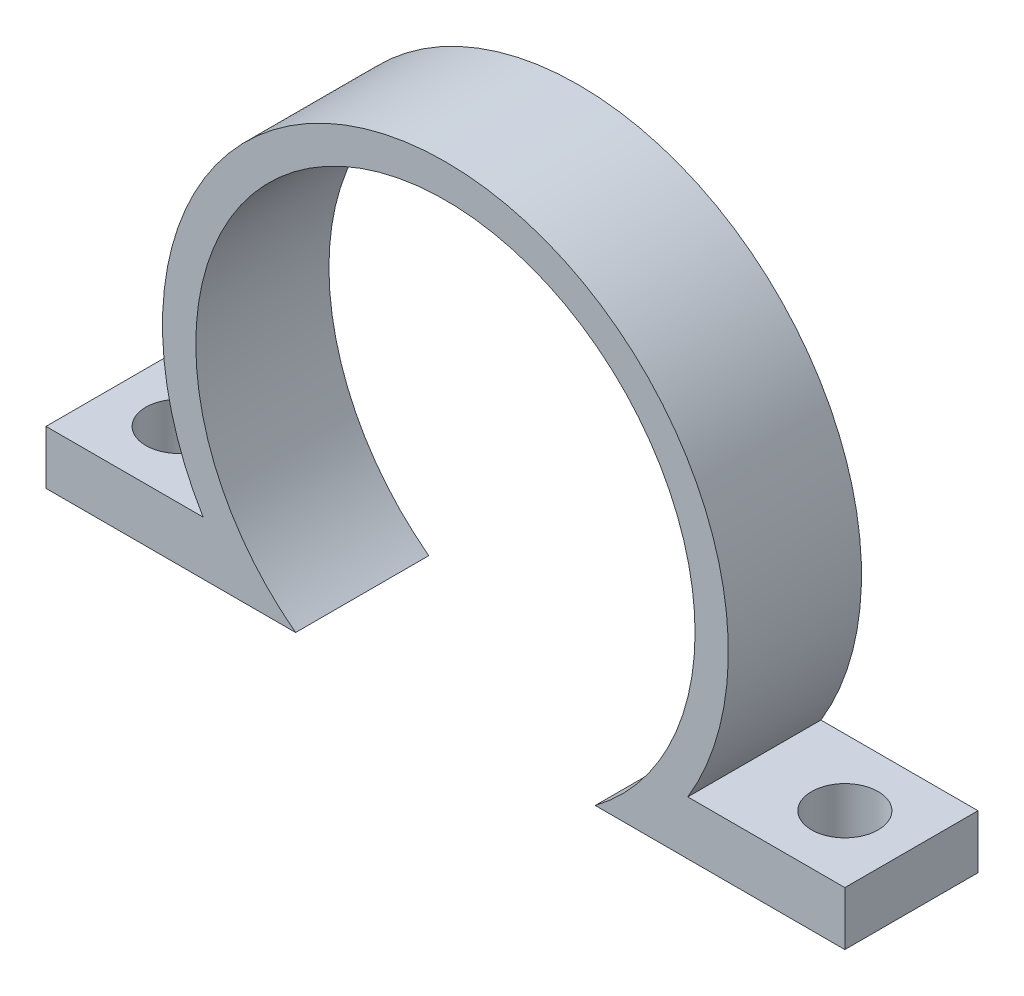
ISO-10303-21;
HEADER;
FILE_DESCRIPTION(('STEP AP214'),'2;1');
FILE_NAME('part.step','',(''),(''),'','','');
FILE_SCHEMA(('AUTOMOTIVE_DESIGN { 1 0 10303 214 1 1 1 1 }'));
ENDSEC;
DATA;
#1=APPLICATION_CONTEXT('core data for automotive mechanical design processes');
#2=APPLICATION_PROTOCOL_DEFINITION('international standard','automotive_design',2000,#1);
#3=PRODUCT_CONTEXT('',#1,'mechanical');
#4=PRODUCT('Part','Part','',(#3));
#5=PRODUCT_RELATED_PRODUCT_CATEGORY('part','',(#4));
#6=PRODUCT_DEFINITION_FORMATION('','',#4);
#7=PRODUCT_DEFINITION_CONTEXT('part definition',#1,'design');
#8=PRODUCT_DEFINITION('design','',#6,#7);
#9=PRODUCT_DEFINITION_SHAPE('','',#8);
#10=(LENGTH_UNIT() NAMED_UNIT(*) SI_UNIT(.MILLI.,.METRE.));
#11=(NAMED_UNIT(*) PLANE_ANGLE_UNIT() SI_UNIT($,.RADIAN.));
#12=(NAMED_UNIT(*) SI_UNIT($,.STERADIAN.) SOLID_ANGLE_UNIT());
#13=UNCERTAINTY_MEASURE_WITH_UNIT(LENGTH_MEASURE(1.E-05),#10,'distance_accuracy_value','');
#14=(GEOMETRIC_REPRESENTATION_CONTEXT(3) GLOBAL_UNCERTAINTY_ASSIGNED_CONTEXT((#13)) GLOBAL_UNIT_ASSIGNED_CONTEXT((#10,
#11,#12)) REPRESENTATION_CONTEXT('',''));
#15=CARTESIAN_POINT('',(0.,0.,0.));
#16=DIRECTION('',(0.,0.,1.));
#17=DIRECTION('',(1.,0.,0.));
#18=AXIS2_PLACEMENT_3D('',#15,#16,#17);
#19=CARTESIAN_POINT('',(25.4,50.8,1.905));
#20=DIRECTION('',(0.,-1.,0.));
#21=DIRECTION('',(0.,0.,-1.));
#22=AXIS2_PLACEMENT_3D('',#19,#20,#21);
#23=CYLINDRICAL_SURFACE('',#22,2.54);
#24=CARTESIAN_POINT('',(25.4,14.2584207409771,1.905));
#25=DIRECTION('',(0.,-1.,0.));
#26=DIRECTION('',(1.,0.,0.));
#27=AXIS2_PLACEMENT_3D('',#24,#25,#26);
#28=CIRCLE('',#27,2.54);
#29=CARTESIAN_POINT('',(27.94,14.2584207409771,1.905));
#30=VERTEX_POINT('',#29);
#31=EDGE_CURVE('E160',#30,#30,#28,.T.);
#32=ORIENTED_EDGE('',*,*,#31,.F.);
#33=EDGE_LOOP('',(#32));
#34=FACE_BOUND('',#33,.T.);
#35=CARTESIAN_POINT('',(25.4,10.16,1.905));
#36=DIRECTION('',(0.,-1.,0.));
#37=DIRECTION('',(1.,0.,0.));
#38=AXIS2_PLACEMENT_3D('',#35,#36,#37);
#39=CIRCLE('',#38,2.54);
#40=CARTESIAN_POINT('',(27.94,10.16,1.905));
#41=VERTEX_POINT('',#40);
#42=EDGE_CURVE('E174',#41,#41,#39,.T.);
#43=ORIENTED_EDGE('',*,*,#42,.T.);
#44=EDGE_LOOP('',(#43));
#45=FACE_BOUND('',#44,.T.);
#46=ADVANCED_FACE('F39',(#34,#45),#23,.F.);
#47=CARTESIAN_POINT('',(0.,25.4,-3.175));
#48=DIRECTION('',(0.,0.,1.));
#49=DIRECTION('',(1.,0.,0.));
#50=AXIS2_PLACEMENT_3D('',#47,#48,#49);
#51=CYLINDRICAL_SURFACE('',#50,21.59);
#52=CARTESIAN_POINT('',(0.,25.4,6.985));
#53=DIRECTION('',(0.,0.,1.));
#54=DIRECTION('',(1.,0.,0.));
#55=AXIS2_PLACEMENT_3D('',#52,#53,#54);
#56=CIRCLE('',#55,21.59);
#57=CARTESIAN_POINT('',(18.4930611748005,14.2584207409772,6.985));
#58=VERTEX_POINT('',#57);
#59=CARTESIAN_POINT('',(-18.4930611748005,14.2584207409772,6.985));
#60=VERTEX_POINT('',#59);
#61=EDGE_CURVE('E54',#58,#60,#56,.T.);
#62=ORIENTED_EDGE('',*,*,#61,.F.);
#63=DIRECTION('',(0.,0.,1.));
#64=VECTOR('',#63,1.);
#65=CARTESIAN_POINT('',(18.4930611748005,14.2584207409772,-3.175));
#66=LINE('',#65,#64);
#67=CARTESIAN_POINT('',(18.4930611748005,14.2584207409772,-3.175));
#68=VERTEX_POINT('',#67);
#69=EDGE_CURVE('E103',#68,#58,#66,.T.);
#70=ORIENTED_EDGE('',*,*,#69,.F.);
#71=CARTESIAN_POINT('',(0.,25.4,-3.175));
#72=DIRECTION('',(0.,0.,1.));
#73=DIRECTION('',(1.,0.,0.));
#74=AXIS2_PLACEMENT_3D('',#71,#72,#73);
#75=CIRCLE('',#74,21.59);
#76=CARTESIAN_POINT('',(-18.4930611748005,14.2584207409772,-3.175));
#77=VERTEX_POINT('',#76);
#78=EDGE_CURVE('E107',#68,#77,#75,.T.);
#79=ORIENTED_EDGE('',*,*,#78,.T.);
#80=DIRECTION('',(0.,0.,1.));
#81=VECTOR('',#80,1.);
#82=CARTESIAN_POINT('',(-18.4930611748005,14.2584207409772,-3.175));
#83=LINE('',#82,#81);
#84=EDGE_CURVE('E158',#77,#60,#83,.T.);
#85=ORIENTED_EDGE('',*,*,#84,.T.);
#86=EDGE_LOOP('',(#62,#70,#79,#85));
#87=FACE_BOUND('',#86,.T.);
#88=ADVANCED_FACE('F105',(#87),#51,.T.);
#89=CARTESIAN_POINT('',(0.,14.2584207409772,-3.175));
#90=DIRECTION('',(0.,1.,0.));
#91=DIRECTION('',(0.,0.,1.));
#92=AXIS2_PLACEMENT_3D('',#89,#90,#91);
#93=PLANE('',#92);
#94=CARTESIAN_POINT('',(-25.4,14.2584207409772,1.905));
#95=DIRECTION('',(0.,1.,0.));
#96=DIRECTION('',(0.,0.,1.));
#97=AXIS2_PLACEMENT_3D('',#94,#95,#96);
#98=CIRCLE('',#97,2.54);
#99=CARTESIAN_POINT('',(-25.4,14.2584207409772,4.445));
#100=VERTEX_POINT('',#99);
#101=EDGE_CURVE('E11',#100,#100,#98,.T.);
#102=ORIENTED_EDGE('',*,*,#101,.F.);
#103=EDGE_LOOP('',(#102));
#104=FACE_BOUND('',#103,.T.);
#105=DIRECTION('',(-1.,0.,0.));
#106=VECTOR('',#105,1.);
#107=CARTESIAN_POINT('',(0.,14.2584207409772,6.985));
#108=LINE('',#107,#106);
#109=CARTESIAN_POINT('',(-30.48,14.2584207409772,6.985));
#110=VERTEX_POINT('',#109);
#111=EDGE_CURVE('E123',#60,#110,#108,.T.);
#112=ORIENTED_EDGE('',*,*,#111,.F.);
#113=ORIENTED_EDGE('',*,*,#84,.F.);
#114=DIRECTION('',(-1.,0.,0.));
#115=VECTOR('',#114,1.);
#116=CARTESIAN_POINT('',(0.,14.2584207409772,-3.175));
#117=LINE('',#116,#115);
#118=CARTESIAN_POINT('',(-30.48,14.2584207409772,-3.175));
#119=VERTEX_POINT('',#118);
#120=EDGE_CURVE('E113',#77,#119,#117,.T.);
#121=ORIENTED_EDGE('',*,*,#120,.T.);
#122=DIRECTION('',(0.,0.,1.));
#123=VECTOR('',#122,1.);
#124=CARTESIAN_POINT('',(-30.48,14.2584207409772,-3.175));
#125=LINE('',#124,#123);
#126=EDGE_CURVE('E161',#119,#110,#125,.T.);
#127=ORIENTED_EDGE('',*,*,#126,.T.);
#128=EDGE_LOOP('',(#112,#113,#121,#127));
#129=FACE_BOUND('',#128,.T.);
#130=ADVANCED_FACE('F188',(#104,#129),#93,.T.);
#131=CARTESIAN_POINT('',(-30.4799999999999,-1.54813890196641E-13,-3.175));
#132=DIRECTION('',(1.,0.,0.));
#133=DIRECTION('',(0.,1.,0.));
#134=AXIS2_PLACEMENT_3D('',#131,#132,#133);
#135=PLANE('',#134);
#136=DIRECTION('',(0.,1.,0.));
#137=VECTOR('',#136,1.);
#138=CARTESIAN_POINT('',(-30.4799999999999,-1.54813890196641E-13,6.985));
#139=LINE('',#138,#137);
#140=CARTESIAN_POINT('',(-30.48,10.16,6.985));
#141=VERTEX_POINT('',#140);
#142=EDGE_CURVE('E126',#141,#110,#139,.T.);
#143=ORIENTED_EDGE('',*,*,#142,.T.);
#144=ORIENTED_EDGE('',*,*,#126,.F.);
#145=DIRECTION('',(0.,1.,0.));
#146=VECTOR('',#145,1.);
#147=CARTESIAN_POINT('',(-30.4799999999999,-1.54813890196641E-13,-3.175));
#148=LINE('',#147,#146);
#149=CARTESIAN_POINT('',(-30.48,10.16,-3.175));
#150=VERTEX_POINT('',#149);
#151=EDGE_CURVE('E138',#150,#119,#148,.T.);
#152=ORIENTED_EDGE('',*,*,#151,.F.);
#153=DIRECTION('',(0.,0.,1.));
#154=VECTOR('',#153,1.);
#155=CARTESIAN_POINT('',(-30.48,10.16,-3.175));
#156=LINE('',#155,#154);
#157=EDGE_CURVE('E163',#150,#141,#156,.T.);
#158=ORIENTED_EDGE('',*,*,#157,.T.);
#159=EDGE_LOOP('',(#143,#144,#152,#158));
#160=FACE_BOUND('',#159,.T.);
#161=ADVANCED_FACE('F191',(#160),#135,.F.);
#162=CARTESIAN_POINT('',(0.,10.16,-3.175));
#163=DIRECTION('',(0.,1.,0.));
#164=DIRECTION('',(-1.,0.,0.));
#165=AXIS2_PLACEMENT_3D('',#162,#163,#164);
#166=PLANE('',#165);
#167=CARTESIAN_POINT('',(-25.4,10.16,1.905));
#168=DIRECTION('',(0.,1.,0.));
#169=DIRECTION('',(-1.,0.,0.));
#170=AXIS2_PLACEMENT_3D('',#167,#168,#169);
#171=CIRCLE('',#170,2.54);
#172=CARTESIAN_POINT('',(-27.94,10.16,1.905));
#173=VERTEX_POINT('',#172);
#174=EDGE_CURVE('E47',#173,#173,#171,.T.);
#175=ORIENTED_EDGE('',*,*,#174,.T.);
#176=EDGE_LOOP('',(#175));
#177=FACE_BOUND('',#176,.T.);
#178=DIRECTION('',(-1.,0.,0.));
#179=VECTOR('',#178,1.);
#180=CARTESIAN_POINT('',(0.,10.16,6.985));
#181=LINE('',#180,#179);
#182=CARTESIAN_POINT('',(-11.43,10.16,6.985));
#183=VERTEX_POINT('',#182);
#184=EDGE_CURVE('E153',#183,#141,#181,.T.);
#185=ORIENTED_EDGE('',*,*,#184,.T.);
#186=ORIENTED_EDGE('',*,*,#157,.F.);
#187=DIRECTION('',(-1.,0.,0.));
#188=VECTOR('',#187,1.);
#189=CARTESIAN_POINT('',(0.,10.16,-3.175));
#190=LINE('',#189,#188);
#191=CARTESIAN_POINT('',(-11.43,10.16,-3.175));
#192=VERTEX_POINT('',#191);
#193=EDGE_CURVE('E135',#192,#150,#190,.T.);
#194=ORIENTED_EDGE('',*,*,#193,.F.);
#195=DIRECTION('',(0.,0.,1.));
#196=VECTOR('',#195,1.);
#197=CARTESIAN_POINT('',(-11.43,10.16,-3.175));
#198=LINE('',#197,#196);
#199=EDGE_CURVE('E165',#192,#183,#198,.T.);
#200=ORIENTED_EDGE('',*,*,#199,.T.);
#201=EDGE_LOOP('',(#185,#186,#194,#200));
#202=FACE_BOUND('',#201,.T.);
#203=ADVANCED_FACE('F179',(#177,#202),#166,.F.);
#204=CARTESIAN_POINT('',(0.,25.4,-3.175));
#205=DIRECTION('',(0.,0.,1.));
#206=DIRECTION('',(1.,0.,0.));
#207=AXIS2_PLACEMENT_3D('',#204,#205,#206);
#208=CYLINDRICAL_SURFACE('',#207,19.05);
#209=CARTESIAN_POINT('',(0.,25.4,6.985));
#210=DIRECTION('',(0.,0.,1.));
#211=DIRECTION('',(1.,0.,0.));
#212=AXIS2_PLACEMENT_3D('',#209,#210,#211);
#213=CIRCLE('',#212,19.05);
#214=CARTESIAN_POINT('',(11.43,10.16,6.985));
#215=VERTEX_POINT('',#214);
#216=EDGE_CURVE('E150',#215,#183,#213,.T.);
#217=ORIENTED_EDGE('',*,*,#216,.T.);
#218=ORIENTED_EDGE('',*,*,#199,.F.);
#219=CARTESIAN_POINT('',(0.,25.4,-3.175));
#220=DIRECTION('',(0.,0.,1.));
#221=DIRECTION('',(1.,0.,0.));
#222=AXIS2_PLACEMENT_3D('',#219,#220,#221);
#223=CIRCLE('',#222,19.05);
#224=CARTESIAN_POINT('',(11.43,10.16,-3.175));
#225=VERTEX_POINT('',#224);
#226=EDGE_CURVE('E132',#225,#192,#223,.T.);
#227=ORIENTED_EDGE('',*,*,#226,.F.);
#228=DIRECTION('',(0.,0.,1.));
#229=VECTOR('',#228,1.);
#230=CARTESIAN_POINT('',(11.43,10.16,-3.175));
#231=LINE('',#230,#229);
#232=EDGE_CURVE('E167',#225,#215,#231,.T.);
#233=ORIENTED_EDGE('',*,*,#232,.T.);
#234=EDGE_LOOP('',(#217,#218,#227,#233));
#235=FACE_BOUND('',#234,.T.);
#236=ADVANCED_FACE('F205',(#235),#208,.F.);
#237=CARTESIAN_POINT('',(0.,10.16,-3.175));
#238=DIRECTION('',(0.,-1.,0.));
#239=DIRECTION('',(1.,0.,0.));
#240=AXIS2_PLACEMENT_3D('',#237,#238,#239);
#241=PLANE('',#240);
#242=ORIENTED_EDGE('',*,*,#42,.F.);
#243=EDGE_LOOP('',(#242));
#244=FACE_BOUND('',#243,.T.);
#245=DIRECTION('',(1.,0.,0.));
#246=VECTOR('',#245,1.);
#247=CARTESIAN_POINT('',(0.,10.16,6.985));
#248=LINE('',#247,#246);
#249=CARTESIAN_POINT('',(30.48,10.16,6.985));
#250=VERTEX_POINT('',#249);
#251=EDGE_CURVE('E147',#215,#250,#248,.T.);
#252=ORIENTED_EDGE('',*,*,#251,.F.);
#253=ORIENTED_EDGE('',*,*,#232,.F.);
#254=DIRECTION('',(1.,0.,0.));
#255=VECTOR('',#254,1.);
#256=CARTESIAN_POINT('',(0.,10.16,-3.175));
#257=LINE('',#256,#255);
#258=CARTESIAN_POINT('',(30.48,10.16,-3.175));
#259=VERTEX_POINT('',#258);
#260=EDGE_CURVE('E130',#225,#259,#257,.T.);
#261=ORIENTED_EDGE('',*,*,#260,.T.);
#262=DIRECTION('',(0.,0.,1.));
#263=VECTOR('',#262,1.);
#264=CARTESIAN_POINT('',(30.48,10.16,-3.175));
#265=LINE('',#264,#263);
#266=EDGE_CURVE('E169',#259,#250,#265,.T.);
#267=ORIENTED_EDGE('',*,*,#266,.T.);
#268=EDGE_LOOP('',(#252,#253,#261,#267));
#269=FACE_BOUND('',#268,.T.);
#270=ADVANCED_FACE('F203',(#244,#269),#241,.T.);
#271=CARTESIAN_POINT('',(30.48,0.,-3.175));
#272=DIRECTION('',(-1.,0.,0.));
#273=DIRECTION('',(0.,-1.,0.));
#274=AXIS2_PLACEMENT_3D('',#271,#272,#273);
#275=PLANE('',#274);
#276=DIRECTION('',(0.,-1.,0.));
#277=VECTOR('',#276,1.);
#278=CARTESIAN_POINT('',(30.48,0.,6.985));
#279=LINE('',#278,#277);
#280=CARTESIAN_POINT('',(30.48,14.2584207409771,6.985));
#281=VERTEX_POINT('',#280);
#282=EDGE_CURVE('E144',#281,#250,#279,.T.);
#283=ORIENTED_EDGE('',*,*,#282,.T.);
#284=ORIENTED_EDGE('',*,*,#266,.F.);
#285=DIRECTION('',(0.,-1.,0.));
#286=VECTOR('',#285,1.);
#287=CARTESIAN_POINT('',(30.48,0.,-3.175));
#288=LINE('',#287,#286);
#289=CARTESIAN_POINT('',(30.48,14.2584207409771,-3.175));
#290=VERTEX_POINT('',#289);
#291=EDGE_CURVE('E62',#290,#259,#288,.T.);
#292=ORIENTED_EDGE('',*,*,#291,.F.);
#293=DIRECTION('',(0.,0.,1.));
#294=VECTOR('',#293,1.);
#295=CARTESIAN_POINT('',(30.48,14.2584207409771,-3.175));
#296=LINE('',#295,#294);
#297=EDGE_CURVE('E112',#290,#281,#296,.T.);
#298=ORIENTED_EDGE('',*,*,#297,.T.);
#299=EDGE_LOOP('',(#283,#284,#292,#298));
#300=FACE_BOUND('',#299,.T.);
#301=ADVANCED_FACE('F199',(#300),#275,.F.);
#302=CARTESIAN_POINT('',(0.,14.2584207409772,-3.175));
#303=DIRECTION('',(0.,-1.,0.));
#304=DIRECTION('',(1.,0.,0.));
#305=AXIS2_PLACEMENT_3D('',#302,#303,#304);
#306=PLANE('',#305);
#307=ORIENTED_EDGE('',*,*,#31,.T.);
#308=EDGE_LOOP('',(#307));
#309=FACE_BOUND('',#308,.T.);
#310=DIRECTION('',(1.,0.,0.));
#311=VECTOR('',#310,1.);
#312=CARTESIAN_POINT('',(0.,14.2584207409772,6.985));
#313=LINE('',#312,#311);
#314=EDGE_CURVE('E142',#58,#281,#313,.T.);
#315=ORIENTED_EDGE('',*,*,#314,.T.);
#316=ORIENTED_EDGE('',*,*,#297,.F.);
#317=DIRECTION('',(1.,0.,0.));
#318=VECTOR('',#317,1.);
#319=CARTESIAN_POINT('',(0.,14.2584207409772,-3.175));
#320=LINE('',#319,#318);
#321=EDGE_CURVE('E116',#68,#290,#320,.T.);
#322=ORIENTED_EDGE('',*,*,#321,.F.);
#323=ORIENTED_EDGE('',*,*,#69,.T.);
#324=EDGE_LOOP('',(#315,#316,#322,#323));
#325=FACE_BOUND('',#324,.T.);
#326=ADVANCED_FACE('F117',(#309,#325),#306,.F.);
#327=CARTESIAN_POINT('',(-25.4,50.8,1.905));
#328=DIRECTION('',(0.,-1.,0.));
#329=DIRECTION('',(0.,0.,-1.));
#330=AXIS2_PLACEMENT_3D('',#327,#328,#329);
#331=CYLINDRICAL_SURFACE('',#330,2.54);
#332=ORIENTED_EDGE('',*,*,#174,.F.);
#333=EDGE_LOOP('',(#332));
#334=FACE_BOUND('',#333,.T.);
#335=ORIENTED_EDGE('',*,*,#101,.T.);
#336=EDGE_LOOP('',(#335));
#337=FACE_BOUND('',#336,.T.);
#338=ADVANCED_FACE('F182',(#334,#337),#331,.F.);
#339=CARTESIAN_POINT('',(0.,50.8,-3.175));
#340=DIRECTION('',(0.,0.,-1.));
#341=DIRECTION('',(-1.,0.,0.));
#342=AXIS2_PLACEMENT_3D('',#339,#340,#341);
#343=PLANE('',#342);
#344=ORIENTED_EDGE('',*,*,#120,.F.);
#345=ORIENTED_EDGE('',*,*,#78,.F.);
#346=ORIENTED_EDGE('',*,*,#321,.T.);
#347=ORIENTED_EDGE('',*,*,#291,.T.);
#348=ORIENTED_EDGE('',*,*,#260,.F.);
#349=ORIENTED_EDGE('',*,*,#226,.T.);
#350=ORIENTED_EDGE('',*,*,#193,.T.);
#351=ORIENTED_EDGE('',*,*,#151,.T.);
#352=EDGE_LOOP('',(#344,#345,#346,#347,#348,#349,#350,#351));
#353=FACE_BOUND('',#352,.T.);
#354=ADVANCED_FACE('F121',(#353),#343,.T.);
#355=CARTESIAN_POINT('',(0.,50.8,6.985));
#356=DIRECTION('',(0.,0.,1.));
#357=DIRECTION('',(1.,0.,0.));
#358=AXIS2_PLACEMENT_3D('',#355,#356,#357);
#359=PLANE('',#358);
#360=ORIENTED_EDGE('',*,*,#314,.F.);
#361=ORIENTED_EDGE('',*,*,#61,.T.);
#362=ORIENTED_EDGE('',*,*,#111,.T.);
#363=ORIENTED_EDGE('',*,*,#142,.F.);
#364=ORIENTED_EDGE('',*,*,#184,.F.);
#365=ORIENTED_EDGE('',*,*,#216,.F.);
#366=ORIENTED_EDGE('',*,*,#251,.T.);
#367=ORIENTED_EDGE('',*,*,#282,.F.);
#368=EDGE_LOOP('',(#360,#361,#362,#363,#364,#365,#366,#367));
#369=FACE_BOUND('',#368,.T.);
#370=ADVANCED_FACE('F41',(#369),#359,.T.);
#371=CLOSED_SHELL('',(#46,#88,#130,#161,#203,#236,#270,#301,#326,#338,#354,#370));
#372=MANIFOLD_SOLID_BREP('B2',#371);
#373=ADVANCED_BREP_SHAPE_REPRESENTATION('',(#18,#372),#14);
#374=SHAPE_DEFINITION_REPRESENTATION(#9,#373);
ENDSEC;
END-ISO-10303-21;
